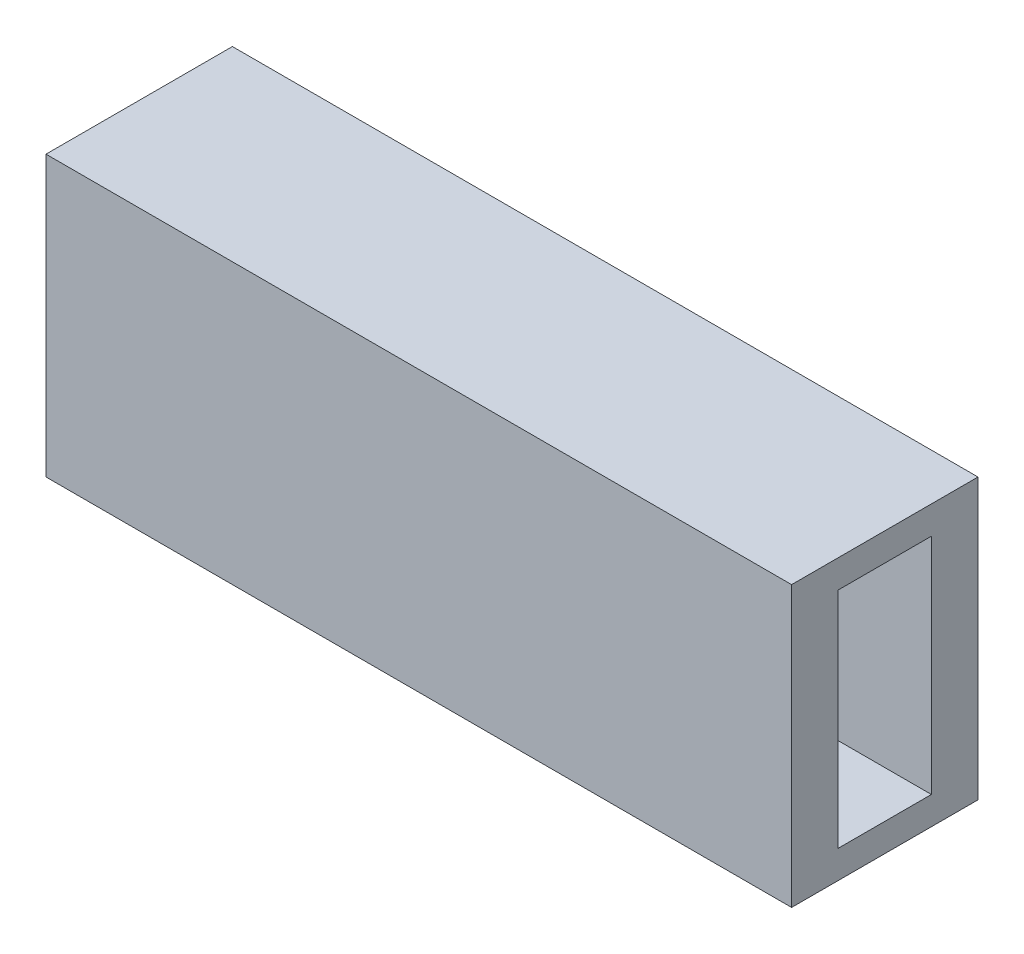
ISO-10303-21;
HEADER;
FILE_DESCRIPTION(('STEP AP214'),'2;1');
FILE_NAME('part.step','',(''),(''),'','','');
FILE_SCHEMA(('AUTOMOTIVE_DESIGN { 1 0 10303 214 1 1 1 1 }'));
ENDSEC;
DATA;
#1=APPLICATION_CONTEXT('core data for automotive mechanical design processes');
#2=APPLICATION_PROTOCOL_DEFINITION('international standard','automotive_design',2000,#1);
#3=PRODUCT_CONTEXT('',#1,'mechanical');
#4=PRODUCT('Part','Part','',(#3));
#5=PRODUCT_RELATED_PRODUCT_CATEGORY('part','',(#4));
#6=PRODUCT_DEFINITION_FORMATION('','',#4);
#7=PRODUCT_DEFINITION_CONTEXT('part definition',#1,'design');
#8=PRODUCT_DEFINITION('design','',#6,#7);
#9=PRODUCT_DEFINITION_SHAPE('','',#8);
#10=(LENGTH_UNIT() NAMED_UNIT(*) SI_UNIT(.MILLI.,.METRE.));
#11=(NAMED_UNIT(*) PLANE_ANGLE_UNIT() SI_UNIT($,.RADIAN.));
#12=(NAMED_UNIT(*) SI_UNIT($,.STERADIAN.) SOLID_ANGLE_UNIT());
#13=UNCERTAINTY_MEASURE_WITH_UNIT(LENGTH_MEASURE(1.E-05),#10,'distance_accuracy_value','');
#14=(GEOMETRIC_REPRESENTATION_CONTEXT(3) GLOBAL_UNCERTAINTY_ASSIGNED_CONTEXT((#13)) GLOBAL_UNIT_ASSIGNED_CONTEXT((#10,
#11,#12)) REPRESENTATION_CONTEXT('',''));
#15=CARTESIAN_POINT('',(0.,0.,0.));
#16=DIRECTION('',(0.,0.,1.));
#17=DIRECTION('',(1.,0.,0.));
#18=AXIS2_PLACEMENT_3D('',#15,#16,#17);
#19=CARTESIAN_POINT('',(60.,0.,0.));
#20=DIRECTION('',(1.,0.,0.));
#21=DIRECTION('',(0.,0.,-1.));
#22=AXIS2_PLACEMENT_3D('',#19,#20,#21);
#23=PLANE('',#22);
#24=DIRECTION('',(0.,-1.,0.));
#25=VECTOR('',#24,1.);
#26=CARTESIAN_POINT('',(60.,-22.5,15.));
#27=LINE('',#26,#25);
#28=CARTESIAN_POINT('',(60.,22.5,15.));
#29=VERTEX_POINT('',#28);
#30=CARTESIAN_POINT('',(60.,-22.5,15.));
#31=VERTEX_POINT('',#30);
#32=EDGE_CURVE('E153',#29,#31,#27,.T.);
#33=ORIENTED_EDGE('',*,*,#32,.T.);
#34=DIRECTION('',(0.,0.,-1.));
#35=VECTOR('',#34,1.);
#36=CARTESIAN_POINT('',(60.,-22.5,-15.));
#37=LINE('',#36,#35);
#38=CARTESIAN_POINT('',(60.,-22.5,-15.));
#39=VERTEX_POINT('',#38);
#40=EDGE_CURVE('E157',#31,#39,#37,.T.);
#41=ORIENTED_EDGE('',*,*,#40,.T.);
#42=DIRECTION('',(0.,1.,0.));
#43=VECTOR('',#42,1.);
#44=CARTESIAN_POINT('',(60.,-22.5,-15.));
#45=LINE('',#44,#43);
#46=CARTESIAN_POINT('',(60.,22.5,-15.));
#47=VERTEX_POINT('',#46);
#48=EDGE_CURVE('E161',#39,#47,#45,.T.);
#49=ORIENTED_EDGE('',*,*,#48,.T.);
#50=DIRECTION('',(0.,0.,1.));
#51=VECTOR('',#50,1.);
#52=CARTESIAN_POINT('',(60.,22.5,-15.));
#53=LINE('',#52,#51);
#54=EDGE_CURVE('E164',#47,#29,#53,.T.);
#55=ORIENTED_EDGE('',*,*,#54,.T.);
#56=EDGE_LOOP('',(#33,#41,#49,#55));
#57=FACE_BOUND('',#56,.T.);
#58=DIRECTION('',(0.,0.,-1.));
#59=VECTOR('',#58,1.);
#60=CARTESIAN_POINT('',(60.,-18.,-7.5));
#61=LINE('',#60,#59);
#62=CARTESIAN_POINT('',(60.,-18.,7.5));
#63=VERTEX_POINT('',#62);
#64=CARTESIAN_POINT('',(60.,-18.,-7.5));
#65=VERTEX_POINT('',#64);
#66=EDGE_CURVE('E114',#63,#65,#61,.T.);
#67=ORIENTED_EDGE('',*,*,#66,.F.);
#68=DIRECTION('',(0.,-1.,0.));
#69=VECTOR('',#68,1.);
#70=CARTESIAN_POINT('',(60.,-18.,7.5));
#71=LINE('',#70,#69);
#72=CARTESIAN_POINT('',(60.,18.,7.5));
#73=VERTEX_POINT('',#72);
#74=EDGE_CURVE('E105',#73,#63,#71,.T.);
#75=ORIENTED_EDGE('',*,*,#74,.F.);
#76=DIRECTION('',(0.,0.,1.));
#77=VECTOR('',#76,1.);
#78=CARTESIAN_POINT('',(60.,18.,-7.5));
#79=LINE('',#78,#77);
#80=CARTESIAN_POINT('',(60.,18.,-7.5));
#81=VERTEX_POINT('',#80);
#82=EDGE_CURVE('E131',#81,#73,#79,.T.);
#83=ORIENTED_EDGE('',*,*,#82,.F.);
#84=DIRECTION('',(0.,1.,0.));
#85=VECTOR('',#84,1.);
#86=CARTESIAN_POINT('',(60.,-18.,-7.5));
#87=LINE('',#86,#85);
#88=EDGE_CURVE('E127',#65,#81,#87,.T.);
#89=ORIENTED_EDGE('',*,*,#88,.F.);
#90=EDGE_LOOP('',(#67,#75,#83,#89));
#91=FACE_BOUND('',#90,.T.);
#92=ADVANCED_FACE('F39',(#57,#91),#23,.T.);
#93=CARTESIAN_POINT('',(-60.,0.,0.));
#94=DIRECTION('',(1.,0.,0.));
#95=DIRECTION('',(0.,0.,-1.));
#96=AXIS2_PLACEMENT_3D('',#93,#94,#95);
#97=PLANE('',#96);
#98=DIRECTION('',(0.,-1.,0.));
#99=VECTOR('',#98,1.);
#100=CARTESIAN_POINT('',(-60.,-22.5,15.));
#101=LINE('',#100,#99);
#102=CARTESIAN_POINT('',(-60.,22.5,15.));
#103=VERTEX_POINT('',#102);
#104=CARTESIAN_POINT('',(-60.,-22.5,15.));
#105=VERTEX_POINT('',#104);
#106=EDGE_CURVE('E123',#103,#105,#101,.T.);
#107=ORIENTED_EDGE('',*,*,#106,.F.);
#108=DIRECTION('',(0.,0.,1.));
#109=VECTOR('',#108,1.);
#110=CARTESIAN_POINT('',(-60.,22.5,-15.));
#111=LINE('',#110,#109);
#112=CARTESIAN_POINT('',(-60.,22.5,-15.));
#113=VERTEX_POINT('',#112);
#114=EDGE_CURVE('E158',#113,#103,#111,.T.);
#115=ORIENTED_EDGE('',*,*,#114,.F.);
#116=DIRECTION('',(0.,1.,0.));
#117=VECTOR('',#116,1.);
#118=CARTESIAN_POINT('',(-60.,-22.5,-15.));
#119=LINE('',#118,#117);
#120=CARTESIAN_POINT('',(-60.,-22.5,-15.));
#121=VERTEX_POINT('',#120);
#122=EDGE_CURVE('E174',#121,#113,#119,.T.);
#123=ORIENTED_EDGE('',*,*,#122,.F.);
#124=DIRECTION('',(0.,0.,-1.));
#125=VECTOR('',#124,1.);
#126=CARTESIAN_POINT('',(-60.,-22.5,-15.));
#127=LINE('',#126,#125);
#128=EDGE_CURVE('E171',#105,#121,#127,.T.);
#129=ORIENTED_EDGE('',*,*,#128,.F.);
#130=EDGE_LOOP('',(#107,#115,#123,#129));
#131=FACE_BOUND('',#130,.T.);
#132=DIRECTION('',(0.,-1.,0.));
#133=VECTOR('',#132,1.);
#134=CARTESIAN_POINT('',(-60.,-18.,7.5));
#135=LINE('',#134,#133);
#136=CARTESIAN_POINT('',(-60.,18.,7.5));
#137=VERTEX_POINT('',#136);
#138=CARTESIAN_POINT('',(-60.,-18.,7.5));
#139=VERTEX_POINT('',#138);
#140=EDGE_CURVE('E63',#137,#139,#135,.T.);
#141=ORIENTED_EDGE('',*,*,#140,.T.);
#142=DIRECTION('',(0.,0.,-1.));
#143=VECTOR('',#142,1.);
#144=CARTESIAN_POINT('',(-60.,-18.,-7.5));
#145=LINE('',#144,#143);
#146=CARTESIAN_POINT('',(-60.,-18.,-7.5));
#147=VERTEX_POINT('',#146);
#148=EDGE_CURVE('E121',#139,#147,#145,.T.);
#149=ORIENTED_EDGE('',*,*,#148,.T.);
#150=DIRECTION('',(0.,1.,0.));
#151=VECTOR('',#150,1.);
#152=CARTESIAN_POINT('',(-60.,-18.,-7.5));
#153=LINE('',#152,#151);
#154=CARTESIAN_POINT('',(-60.,18.,-7.5));
#155=VERTEX_POINT('',#154);
#156=EDGE_CURVE('E140',#147,#155,#153,.T.);
#157=ORIENTED_EDGE('',*,*,#156,.T.);
#158=DIRECTION('',(0.,0.,1.));
#159=VECTOR('',#158,1.);
#160=CARTESIAN_POINT('',(-60.,18.,-7.5));
#161=LINE('',#160,#159);
#162=EDGE_CURVE('E115',#155,#137,#161,.T.);
#163=ORIENTED_EDGE('',*,*,#162,.T.);
#164=EDGE_LOOP('',(#141,#149,#157,#163));
#165=FACE_BOUND('',#164,.T.);
#166=ADVANCED_FACE('F197',(#131,#165),#97,.F.);
#167=CARTESIAN_POINT('',(60.,-22.5,15.));
#168=DIRECTION('',(0.,0.,-1.));
#169=DIRECTION('',(-1.,0.,0.));
#170=AXIS2_PLACEMENT_3D('',#167,#168,#169);
#171=PLANE('',#170);
#172=ORIENTED_EDGE('',*,*,#106,.T.);
#173=DIRECTION('',(-1.,0.,0.));
#174=VECTOR('',#173,1.);
#175=CARTESIAN_POINT('',(60.,-22.5,15.));
#176=LINE('',#175,#174);
#177=EDGE_CURVE('E11',#31,#105,#176,.T.);
#178=ORIENTED_EDGE('',*,*,#177,.F.);
#179=ORIENTED_EDGE('',*,*,#32,.F.);
#180=DIRECTION('',(-1.,0.,0.));
#181=VECTOR('',#180,1.);
#182=CARTESIAN_POINT('',(60.,22.5,15.));
#183=LINE('',#182,#181);
#184=EDGE_CURVE('E167',#29,#103,#183,.T.);
#185=ORIENTED_EDGE('',*,*,#184,.T.);
#186=EDGE_LOOP('',(#172,#178,#179,#185));
#187=FACE_BOUND('',#186,.T.);
#188=ADVANCED_FACE('F41',(#187),#171,.F.);
#189=CARTESIAN_POINT('',(60.,-22.5,-15.));
#190=DIRECTION('',(0.,1.,0.));
#191=DIRECTION('',(0.,0.,1.));
#192=AXIS2_PLACEMENT_3D('',#189,#190,#191);
#193=PLANE('',#192);
#194=ORIENTED_EDGE('',*,*,#128,.T.);
#195=DIRECTION('',(-1.,0.,0.));
#196=VECTOR('',#195,1.);
#197=CARTESIAN_POINT('',(60.,-22.5,-15.));
#198=LINE('',#197,#196);
#199=EDGE_CURVE('E48',#39,#121,#198,.T.);
#200=ORIENTED_EDGE('',*,*,#199,.F.);
#201=ORIENTED_EDGE('',*,*,#40,.F.);
#202=ORIENTED_EDGE('',*,*,#177,.T.);
#203=EDGE_LOOP('',(#194,#200,#201,#202));
#204=FACE_BOUND('',#203,.T.);
#205=ADVANCED_FACE('F207',(#204),#193,.F.);
#206=CARTESIAN_POINT('',(60.,-22.5,-15.));
#207=DIRECTION('',(0.,0.,1.));
#208=DIRECTION('',(1.,0.,0.));
#209=AXIS2_PLACEMENT_3D('',#206,#207,#208);
#210=PLANE('',#209);
#211=ORIENTED_EDGE('',*,*,#122,.T.);
#212=DIRECTION('',(-1.,0.,0.));
#213=VECTOR('',#212,1.);
#214=CARTESIAN_POINT('',(60.,22.5,-15.));
#215=LINE('',#214,#213);
#216=EDGE_CURVE('E182',#47,#113,#215,.T.);
#217=ORIENTED_EDGE('',*,*,#216,.F.);
#218=ORIENTED_EDGE('',*,*,#48,.F.);
#219=ORIENTED_EDGE('',*,*,#199,.T.);
#220=EDGE_LOOP('',(#211,#217,#218,#219));
#221=FACE_BOUND('',#220,.T.);
#222=ADVANCED_FACE('F191',(#221),#210,.F.);
#223=CARTESIAN_POINT('',(60.,22.5,-15.));
#224=DIRECTION('',(0.,-1.,0.));
#225=DIRECTION('',(0.,0.,-1.));
#226=AXIS2_PLACEMENT_3D('',#223,#224,#225);
#227=PLANE('',#226);
#228=ORIENTED_EDGE('',*,*,#114,.T.);
#229=ORIENTED_EDGE('',*,*,#184,.F.);
#230=ORIENTED_EDGE('',*,*,#54,.F.);
#231=ORIENTED_EDGE('',*,*,#216,.T.);
#232=EDGE_LOOP('',(#228,#229,#230,#231));
#233=FACE_BOUND('',#232,.T.);
#234=ADVANCED_FACE('F201',(#233),#227,.F.);
#235=CARTESIAN_POINT('',(60.,-18.,7.5));
#236=DIRECTION('',(0.,0.,-1.));
#237=DIRECTION('',(-1.,0.,0.));
#238=AXIS2_PLACEMENT_3D('',#235,#236,#237);
#239=PLANE('',#238);
#240=ORIENTED_EDGE('',*,*,#140,.F.);
#241=DIRECTION('',(-1.,0.,0.));
#242=VECTOR('',#241,1.);
#243=CARTESIAN_POINT('',(60.,18.,7.5));
#244=LINE('',#243,#242);
#245=EDGE_CURVE('E109',#73,#137,#244,.T.);
#246=ORIENTED_EDGE('',*,*,#245,.F.);
#247=ORIENTED_EDGE('',*,*,#74,.T.);
#248=DIRECTION('',(-1.,0.,0.));
#249=VECTOR('',#248,1.);
#250=CARTESIAN_POINT('',(60.,-18.,7.5));
#251=LINE('',#250,#249);
#252=EDGE_CURVE('E108',#63,#139,#251,.T.);
#253=ORIENTED_EDGE('',*,*,#252,.T.);
#254=EDGE_LOOP('',(#240,#246,#247,#253));
#255=FACE_BOUND('',#254,.T.);
#256=ADVANCED_FACE('F107',(#255),#239,.T.);
#257=CARTESIAN_POINT('',(60.,-18.,-7.5));
#258=DIRECTION('',(0.,1.,0.));
#259=DIRECTION('',(0.,0.,1.));
#260=AXIS2_PLACEMENT_3D('',#257,#258,#259);
#261=PLANE('',#260);
#262=ORIENTED_EDGE('',*,*,#148,.F.);
#263=ORIENTED_EDGE('',*,*,#252,.F.);
#264=ORIENTED_EDGE('',*,*,#66,.T.);
#265=DIRECTION('',(-1.,0.,0.));
#266=VECTOR('',#265,1.);
#267=CARTESIAN_POINT('',(60.,-18.,-7.5));
#268=LINE('',#267,#266);
#269=EDGE_CURVE('E124',#65,#147,#268,.T.);
#270=ORIENTED_EDGE('',*,*,#269,.T.);
#271=EDGE_LOOP('',(#262,#263,#264,#270));
#272=FACE_BOUND('',#271,.T.);
#273=ADVANCED_FACE('F118',(#272),#261,.T.);
#274=CARTESIAN_POINT('',(60.,-18.,-7.5));
#275=DIRECTION('',(0.,0.,1.));
#276=DIRECTION('',(1.,0.,0.));
#277=AXIS2_PLACEMENT_3D('',#274,#275,#276);
#278=PLANE('',#277);
#279=ORIENTED_EDGE('',*,*,#156,.F.);
#280=ORIENTED_EDGE('',*,*,#269,.F.);
#281=ORIENTED_EDGE('',*,*,#88,.T.);
#282=DIRECTION('',(-1.,0.,0.));
#283=VECTOR('',#282,1.);
#284=CARTESIAN_POINT('',(60.,18.,-7.5));
#285=LINE('',#284,#283);
#286=EDGE_CURVE('E55',#81,#155,#285,.T.);
#287=ORIENTED_EDGE('',*,*,#286,.T.);
#288=EDGE_LOOP('',(#279,#280,#281,#287));
#289=FACE_BOUND('',#288,.T.);
#290=ADVANCED_FACE('F230',(#289),#278,.T.);
#291=CARTESIAN_POINT('',(60.,18.,-7.5));
#292=DIRECTION('',(0.,-1.,0.));
#293=DIRECTION('',(0.,0.,-1.));
#294=AXIS2_PLACEMENT_3D('',#291,#292,#293);
#295=PLANE('',#294);
#296=ORIENTED_EDGE('',*,*,#162,.F.);
#297=ORIENTED_EDGE('',*,*,#286,.F.);
#298=ORIENTED_EDGE('',*,*,#82,.T.);
#299=ORIENTED_EDGE('',*,*,#245,.T.);
#300=EDGE_LOOP('',(#296,#297,#298,#299));
#301=FACE_BOUND('',#300,.T.);
#302=ADVANCED_FACE('F234',(#301),#295,.T.);
#303=CLOSED_SHELL('',(#92,#166,#188,#205,#222,#234,#256,#273,#290,#302));
#304=MANIFOLD_SOLID_BREP('B2',#303);
#305=ADVANCED_BREP_SHAPE_REPRESENTATION('',(#18,#304),#14);
#306=SHAPE_DEFINITION_REPRESENTATION(#9,#305);
ENDSEC;
END-ISO-10303-21;
